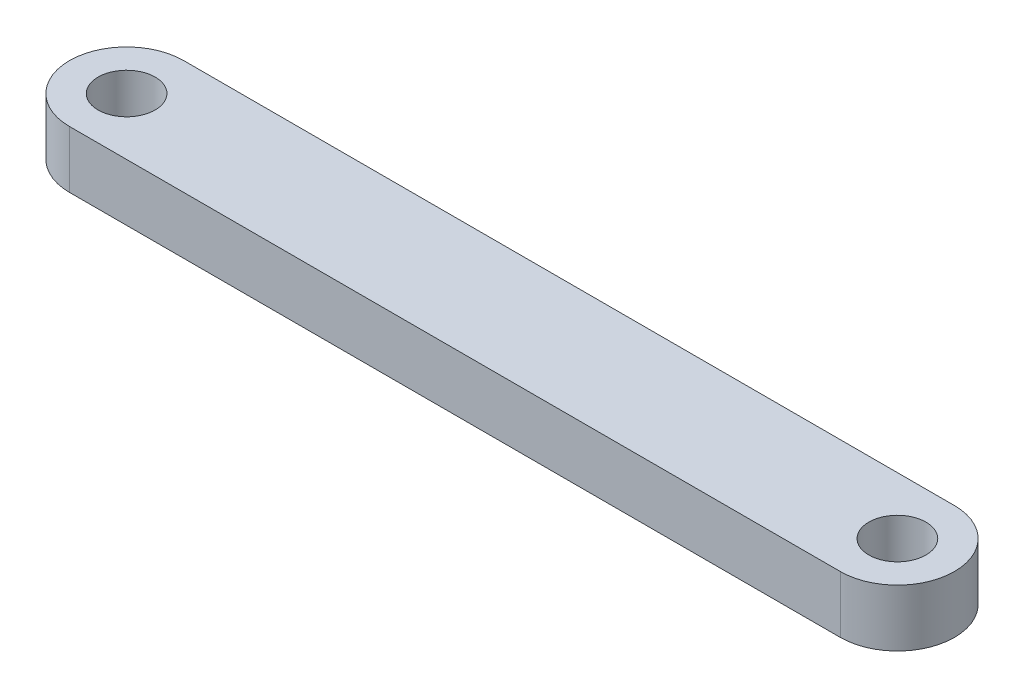
ISO-10303-21;
HEADER;
FILE_DESCRIPTION(('STEP AP214'),'2;1');
FILE_NAME('part.step','',(''),(''),'','','');
FILE_SCHEMA(('AUTOMOTIVE_DESIGN { 1 0 10303 214 1 1 1 1 }'));
ENDSEC;
DATA;
#1=APPLICATION_CONTEXT('core data for automotive mechanical design processes');
#2=APPLICATION_PROTOCOL_DEFINITION('international standard','automotive_design',2000,#1);
#3=PRODUCT_CONTEXT('',#1,'mechanical');
#4=PRODUCT('Part','Part','',(#3));
#5=PRODUCT_RELATED_PRODUCT_CATEGORY('part','',(#4));
#6=PRODUCT_DEFINITION_FORMATION('','',#4);
#7=PRODUCT_DEFINITION_CONTEXT('part definition',#1,'design');
#8=PRODUCT_DEFINITION('design','',#6,#7);
#9=PRODUCT_DEFINITION_SHAPE('','',#8);
#10=(LENGTH_UNIT() NAMED_UNIT(*) SI_UNIT(.MILLI.,.METRE.));
#11=(NAMED_UNIT(*) PLANE_ANGLE_UNIT() SI_UNIT($,.RADIAN.));
#12=(NAMED_UNIT(*) SI_UNIT($,.STERADIAN.) SOLID_ANGLE_UNIT());
#13=UNCERTAINTY_MEASURE_WITH_UNIT(LENGTH_MEASURE(1.E-05),#10,'distance_accuracy_value','');
#14=(GEOMETRIC_REPRESENTATION_CONTEXT(3) GLOBAL_UNCERTAINTY_ASSIGNED_CONTEXT((#13)) GLOBAL_UNIT_ASSIGNED_CONTEXT((#10,
#11,#12)) REPRESENTATION_CONTEXT('',''));
#15=CARTESIAN_POINT('',(0.,0.,0.));
#16=DIRECTION('',(0.,0.,1.));
#17=DIRECTION('',(1.,0.,0.));
#18=AXIS2_PLACEMENT_3D('',#15,#16,#17);
#19=CARTESIAN_POINT('',(-675.,50.,0.));
#20=DIRECTION('',(0.,1.,0.));
#21=DIRECTION('',(0.,0.,1.));
#22=AXIS2_PLACEMENT_3D('',#19,#20,#21);
#23=PLANE('',#22);
#24=CARTESIAN_POINT('',(-675.,50.,0.));
#25=DIRECTION('',(0.,1.,0.));
#26=DIRECTION('',(0.,0.,1.));
#27=AXIS2_PLACEMENT_3D('',#24,#25,#26);
#28=CIRCLE('',#27,50.);
#29=CARTESIAN_POINT('',(-675.,50.,50.));
#30=VERTEX_POINT('',#29);
#31=EDGE_CURVE('E112',#30,#30,#28,.T.);
#32=ORIENTED_EDGE('',*,*,#31,.F.);
#33=EDGE_LOOP('',(#32));
#34=FACE_BOUND('',#33,.T.);
#35=CARTESIAN_POINT('',(-675.,50.,0.));
#36=DIRECTION('',(0.,1.,0.));
#37=DIRECTION('',(0.,0.,1.));
#38=AXIS2_PLACEMENT_3D('',#35,#36,#37);
#39=CIRCLE('',#38,100.);
#40=CARTESIAN_POINT('',(-675.,50.,-100.));
#41=VERTEX_POINT('',#40);
#42=CARTESIAN_POINT('',(-675.,50.,100.));
#43=VERTEX_POINT('',#42);
#44=EDGE_CURVE('E91',#41,#43,#39,.T.);
#45=ORIENTED_EDGE('',*,*,#44,.T.);
#46=DIRECTION('',(1.,0.,0.));
#47=VECTOR('',#46,1.);
#48=CARTESIAN_POINT('',(-675.,50.,100.));
#49=LINE('',#48,#47);
#50=CARTESIAN_POINT('',(675.,50.,99.9999999999998));
#51=VERTEX_POINT('',#50);
#52=EDGE_CURVE('E86',#43,#51,#49,.T.);
#53=ORIENTED_EDGE('',*,*,#52,.T.);
#54=CARTESIAN_POINT('',(675.,50.,-2.47990976827339E-13));
#55=DIRECTION('',(0.,1.,0.));
#56=DIRECTION('',(0.,0.,1.));
#57=AXIS2_PLACEMENT_3D('',#54,#55,#56);
#58=CIRCLE('',#57,100.);
#59=CARTESIAN_POINT('',(675.,50.,-100.));
#60=VERTEX_POINT('',#59);
#61=EDGE_CURVE('E89',#51,#60,#58,.T.);
#62=ORIENTED_EDGE('',*,*,#61,.T.);
#63=DIRECTION('',(-1.,0.,0.));
#64=VECTOR('',#63,1.);
#65=CARTESIAN_POINT('',(-675.,50.,-100.));
#66=LINE('',#65,#64);
#67=EDGE_CURVE('E56',#60,#41,#66,.T.);
#68=ORIENTED_EDGE('',*,*,#67,.T.);
#69=EDGE_LOOP('',(#45,#53,#62,#68));
#70=FACE_BOUND('',#69,.T.);
#71=CARTESIAN_POINT('',(675.,50.,-2.47990976827339E-13));
#72=DIRECTION('',(0.,1.,0.));
#73=DIRECTION('',(0.,0.,1.));
#74=AXIS2_PLACEMENT_3D('',#71,#72,#73);
#75=CIRCLE('',#74,50.);
#76=CARTESIAN_POINT('',(675.,50.,49.9999999999998));
#77=VERTEX_POINT('',#76);
#78=EDGE_CURVE('E134',#77,#77,#75,.T.);
#79=ORIENTED_EDGE('',*,*,#78,.F.);
#80=EDGE_LOOP('',(#79));
#81=FACE_BOUND('',#80,.T.);
#82=ADVANCED_FACE('F38',(#34,#70,#81),#23,.T.);
#83=CARTESIAN_POINT('',(-675.,-50.,0.));
#84=DIRECTION('',(0.,1.,0.));
#85=DIRECTION('',(0.,0.,1.));
#86=AXIS2_PLACEMENT_3D('',#83,#84,#85);
#87=PLANE('',#86);
#88=CARTESIAN_POINT('',(-675.,-50.,0.));
#89=DIRECTION('',(0.,1.,0.));
#90=DIRECTION('',(0.,0.,1.));
#91=AXIS2_PLACEMENT_3D('',#88,#89,#90);
#92=CIRCLE('',#91,100.);
#93=CARTESIAN_POINT('',(-675.,-50.,-100.));
#94=VERTEX_POINT('',#93);
#95=CARTESIAN_POINT('',(-675.,-50.,100.));
#96=VERTEX_POINT('',#95);
#97=EDGE_CURVE('E108',#94,#96,#92,.T.);
#98=ORIENTED_EDGE('',*,*,#97,.F.);
#99=DIRECTION('',(-1.,0.,0.));
#100=VECTOR('',#99,1.);
#101=CARTESIAN_POINT('',(-675.,-50.,-100.));
#102=LINE('',#101,#100);
#103=CARTESIAN_POINT('',(675.,-50.,-100.));
#104=VERTEX_POINT('',#103);
#105=EDGE_CURVE('E79',#104,#94,#102,.T.);
#106=ORIENTED_EDGE('',*,*,#105,.F.);
#107=CARTESIAN_POINT('',(675.,-50.,-2.47990976827339E-13));
#108=DIRECTION('',(0.,1.,0.));
#109=DIRECTION('',(0.,0.,1.));
#110=AXIS2_PLACEMENT_3D('',#107,#108,#109);
#111=CIRCLE('',#110,100.);
#112=CARTESIAN_POINT('',(675.,-50.,99.9999999999998));
#113=VERTEX_POINT('',#112);
#114=EDGE_CURVE('E73',#113,#104,#111,.T.);
#115=ORIENTED_EDGE('',*,*,#114,.F.);
#116=DIRECTION('',(1.,0.,0.));
#117=VECTOR('',#116,1.);
#118=CARTESIAN_POINT('',(-675.,-50.,100.));
#119=LINE('',#118,#117);
#120=EDGE_CURVE('E96',#96,#113,#119,.T.);
#121=ORIENTED_EDGE('',*,*,#120,.F.);
#122=EDGE_LOOP('',(#98,#106,#115,#121));
#123=FACE_BOUND('',#122,.T.);
#124=CARTESIAN_POINT('',(-675.,-50.,0.));
#125=DIRECTION('',(0.,1.,0.));
#126=DIRECTION('',(0.,0.,1.));
#127=AXIS2_PLACEMENT_3D('',#124,#125,#126);
#128=CIRCLE('',#127,50.);
#129=CARTESIAN_POINT('',(-675.,-50.,50.));
#130=VERTEX_POINT('',#129);
#131=EDGE_CURVE('E131',#130,#130,#128,.T.);
#132=ORIENTED_EDGE('',*,*,#131,.T.);
#133=EDGE_LOOP('',(#132));
#134=FACE_BOUND('',#133,.T.);
#135=CARTESIAN_POINT('',(675.,-50.,-2.47990976827339E-13));
#136=DIRECTION('',(0.,1.,0.));
#137=DIRECTION('',(0.,0.,1.));
#138=AXIS2_PLACEMENT_3D('',#135,#136,#137);
#139=CIRCLE('',#138,50.);
#140=CARTESIAN_POINT('',(675.,-50.,49.9999999999998));
#141=VERTEX_POINT('',#140);
#142=EDGE_CURVE('E137',#141,#141,#139,.T.);
#143=ORIENTED_EDGE('',*,*,#142,.T.);
#144=EDGE_LOOP('',(#143));
#145=FACE_BOUND('',#144,.T.);
#146=ADVANCED_FACE('F125',(#123,#134,#145),#87,.F.);
#147=CARTESIAN_POINT('',(-675.,50.,0.));
#148=DIRECTION('',(0.,-1.,0.));
#149=DIRECTION('',(0.,0.,-1.));
#150=AXIS2_PLACEMENT_3D('',#147,#148,#149);
#151=CYLINDRICAL_SURFACE('',#150,100.);
#152=ORIENTED_EDGE('',*,*,#97,.T.);
#153=DIRECTION('',(0.,-1.,0.));
#154=VECTOR('',#153,1.);
#155=CARTESIAN_POINT('',(-675.,50.,100.));
#156=LINE('',#155,#154);
#157=EDGE_CURVE('E11',#43,#96,#156,.T.);
#158=ORIENTED_EDGE('',*,*,#157,.F.);
#159=ORIENTED_EDGE('',*,*,#44,.F.);
#160=DIRECTION('',(0.,-1.,0.));
#161=VECTOR('',#160,1.);
#162=CARTESIAN_POINT('',(-675.,50.,-100.));
#163=LINE('',#162,#161);
#164=EDGE_CURVE('E104',#41,#94,#163,.T.);
#165=ORIENTED_EDGE('',*,*,#164,.T.);
#166=EDGE_LOOP('',(#152,#158,#159,#165));
#167=FACE_BOUND('',#166,.T.);
#168=ADVANCED_FACE('F40',(#167),#151,.T.);
#169=CARTESIAN_POINT('',(-675.,50.,100.));
#170=DIRECTION('',(0.,0.,-1.));
#171=DIRECTION('',(-1.,0.,0.));
#172=AXIS2_PLACEMENT_3D('',#169,#170,#171);
#173=PLANE('',#172);
#174=ORIENTED_EDGE('',*,*,#120,.T.);
#175=DIRECTION('',(0.,-1.,0.));
#176=VECTOR('',#175,1.);
#177=CARTESIAN_POINT('',(675.,50.,99.9999999999998));
#178=LINE('',#177,#176);
#179=EDGE_CURVE('E48',#51,#113,#178,.T.);
#180=ORIENTED_EDGE('',*,*,#179,.F.);
#181=ORIENTED_EDGE('',*,*,#52,.F.);
#182=ORIENTED_EDGE('',*,*,#157,.T.);
#183=EDGE_LOOP('',(#174,#180,#181,#182));
#184=FACE_BOUND('',#183,.T.);
#185=ADVANCED_FACE('F95',(#184),#173,.F.);
#186=CARTESIAN_POINT('',(675.,50.,-2.47990976827339E-13));
#187=DIRECTION('',(0.,-1.,0.));
#188=DIRECTION('',(0.,0.,-1.));
#189=AXIS2_PLACEMENT_3D('',#186,#187,#188);
#190=CYLINDRICAL_SURFACE('',#189,100.);
#191=ORIENTED_EDGE('',*,*,#114,.T.);
#192=DIRECTION('',(0.,-1.,0.));
#193=VECTOR('',#192,1.);
#194=CARTESIAN_POINT('',(675.,50.,-100.));
#195=LINE('',#194,#193);
#196=EDGE_CURVE('E98',#60,#104,#195,.T.);
#197=ORIENTED_EDGE('',*,*,#196,.F.);
#198=ORIENTED_EDGE('',*,*,#61,.F.);
#199=ORIENTED_EDGE('',*,*,#179,.T.);
#200=EDGE_LOOP('',(#191,#197,#198,#199));
#201=FACE_BOUND('',#200,.T.);
#202=ADVANCED_FACE('F99',(#201),#190,.T.);
#203=CARTESIAN_POINT('',(-675.,50.,-100.));
#204=DIRECTION('',(0.,0.,1.));
#205=DIRECTION('',(1.,0.,0.));
#206=AXIS2_PLACEMENT_3D('',#203,#204,#205);
#207=PLANE('',#206);
#208=ORIENTED_EDGE('',*,*,#105,.T.);
#209=ORIENTED_EDGE('',*,*,#164,.F.);
#210=ORIENTED_EDGE('',*,*,#67,.F.);
#211=ORIENTED_EDGE('',*,*,#196,.T.);
#212=EDGE_LOOP('',(#208,#209,#210,#211));
#213=FACE_BOUND('',#212,.T.);
#214=ADVANCED_FACE('F122',(#213),#207,.F.);
#215=CARTESIAN_POINT('',(-675.,50.,0.));
#216=DIRECTION('',(0.,-1.,0.));
#217=DIRECTION('',(0.,0.,-1.));
#218=AXIS2_PLACEMENT_3D('',#215,#216,#217);
#219=CYLINDRICAL_SURFACE('',#218,50.);
#220=ORIENTED_EDGE('',*,*,#31,.T.);
#221=EDGE_LOOP('',(#220));
#222=FACE_BOUND('',#221,.T.);
#223=ORIENTED_EDGE('',*,*,#131,.F.);
#224=EDGE_LOOP('',(#223));
#225=FACE_BOUND('',#224,.T.);
#226=ADVANCED_FACE('F156',(#222,#225),#219,.F.);
#227=CARTESIAN_POINT('',(675.,50.,-2.47990976827339E-13));
#228=DIRECTION('',(0.,-1.,0.));
#229=DIRECTION('',(0.,0.,-1.));
#230=AXIS2_PLACEMENT_3D('',#227,#228,#229);
#231=CYLINDRICAL_SURFACE('',#230,50.);
#232=ORIENTED_EDGE('',*,*,#78,.T.);
#233=EDGE_LOOP('',(#232));
#234=FACE_BOUND('',#233,.T.);
#235=ORIENTED_EDGE('',*,*,#142,.F.);
#236=EDGE_LOOP('',(#235));
#237=FACE_BOUND('',#236,.T.);
#238=ADVANCED_FACE('F145',(#234,#237),#231,.F.);
#239=CLOSED_SHELL('',(#82,#146,#168,#185,#202,#214,#226,#238));
#240=MANIFOLD_SOLID_BREP('B2',#239);
#241=ADVANCED_BREP_SHAPE_REPRESENTATION('',(#18,#240),#14);
#242=SHAPE_DEFINITION_REPRESENTATION(#9,#241);
ENDSEC;
END-ISO-10303-21;
